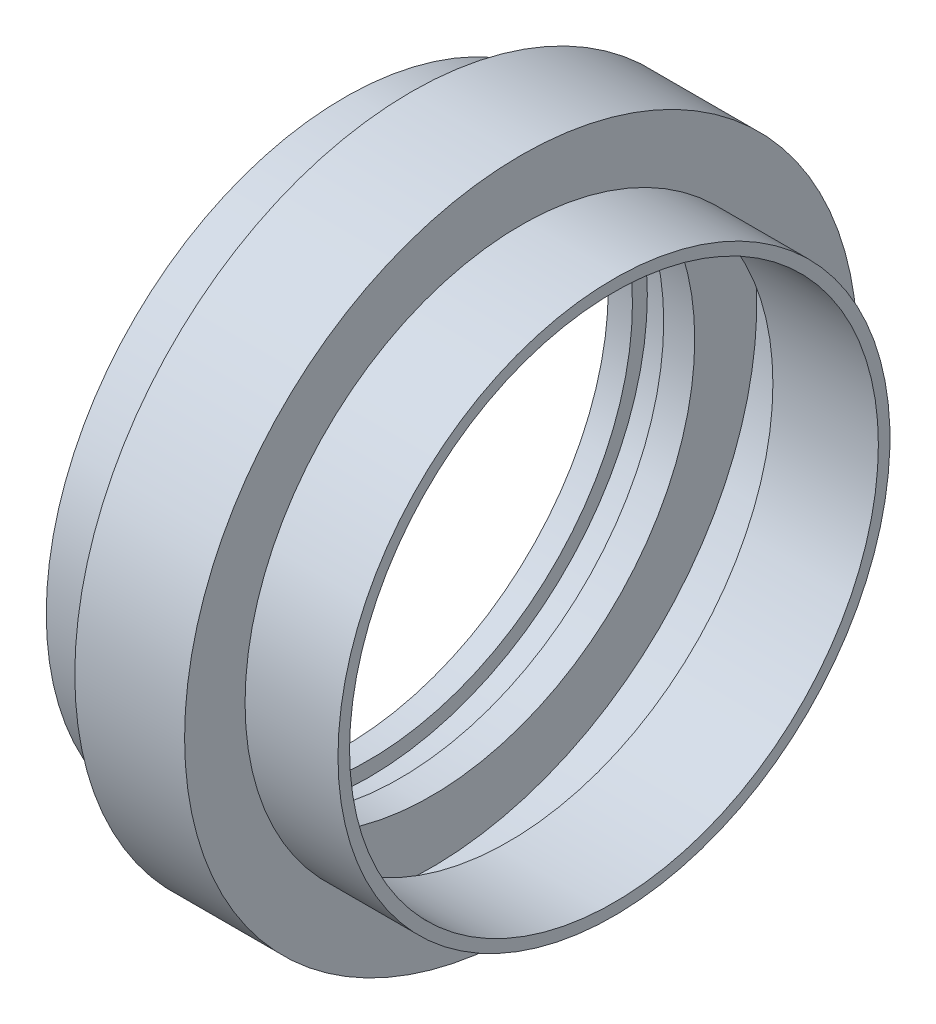
ISO-10303-21;
HEADER;
FILE_DESCRIPTION(('STEP AP214'),'2;1');
FILE_NAME('part.step','',(''),(''),'','','');
FILE_SCHEMA(('AUTOMOTIVE_DESIGN { 1 0 10303 214 1 1 1 1 }'));
ENDSEC;
DATA;
#1=APPLICATION_CONTEXT('core data for automotive mechanical design processes');
#2=APPLICATION_PROTOCOL_DEFINITION('international standard','automotive_design',2000,#1);
#3=PRODUCT_CONTEXT('',#1,'mechanical');
#4=PRODUCT('Part','Part','',(#3));
#5=PRODUCT_RELATED_PRODUCT_CATEGORY('part','',(#4));
#6=PRODUCT_DEFINITION_FORMATION('','',#4);
#7=PRODUCT_DEFINITION_CONTEXT('part definition',#1,'design');
#8=PRODUCT_DEFINITION('design','',#6,#7);
#9=PRODUCT_DEFINITION_SHAPE('','',#8);
#10=(LENGTH_UNIT() NAMED_UNIT(*) SI_UNIT(.MILLI.,.METRE.));
#11=(NAMED_UNIT(*) PLANE_ANGLE_UNIT() SI_UNIT($,.RADIAN.));
#12=(NAMED_UNIT(*) SI_UNIT($,.STERADIAN.) SOLID_ANGLE_UNIT());
#13=UNCERTAINTY_MEASURE_WITH_UNIT(LENGTH_MEASURE(1.E-05),#10,'distance_accuracy_value','');
#14=(GEOMETRIC_REPRESENTATION_CONTEXT(3) GLOBAL_UNCERTAINTY_ASSIGNED_CONTEXT((#13)) GLOBAL_UNIT_ASSIGNED_CONTEXT((#10,
#11,#12)) REPRESENTATION_CONTEXT('',''));
#15=CARTESIAN_POINT('',(0.,0.,0.));
#16=DIRECTION('',(0.,0.,1.));
#17=DIRECTION('',(1.,0.,0.));
#18=AXIS2_PLACEMENT_3D('',#15,#16,#17);
#19=CARTESIAN_POINT('',(8.09094189487786,-54.,0.));
#20=DIRECTION('',(-1.,0.,0.));
#21=DIRECTION('',(0.,0.,1.));
#22=AXIS2_PLACEMENT_3D('',#19,#20,#21);
#23=CYLINDRICAL_SURFACE('',#22,54.);
#24=CARTESIAN_POINT('',(0.,-54.,0.));
#25=DIRECTION('',(-1.,0.,0.));
#26=DIRECTION('',(0.,0.,1.));
#27=AXIS2_PLACEMENT_3D('',#24,#25,#26);
#28=CIRCLE('',#27,54.);
#29=CARTESIAN_POINT('',(0.,-54.,54.));
#30=VERTEX_POINT('',#29);
#31=EDGE_CURVE('E110',#30,#30,#28,.T.);
#32=ORIENTED_EDGE('',*,*,#31,.F.);
#33=EDGE_LOOP('',(#32));
#34=FACE_BOUND('',#33,.T.);
#35=CARTESIAN_POINT('',(-4.95240185899575,-54.,0.));
#36=DIRECTION('',(-1.,0.,0.));
#37=DIRECTION('',(0.,0.,1.));
#38=AXIS2_PLACEMENT_3D('',#35,#36,#37);
#39=CIRCLE('',#38,54.);
#40=CARTESIAN_POINT('',(-4.95240185899575,-54.,54.));
#41=VERTEX_POINT('',#40);
#42=EDGE_CURVE('E10',#41,#41,#39,.T.);
#43=ORIENTED_EDGE('',*,*,#42,.T.);
#44=EDGE_LOOP('',(#43));
#45=FACE_BOUND('',#44,.T.);
#46=ADVANCED_FACE('F43',(#34,#45),#23,.F.);
#47=CARTESIAN_POINT('',(-4.95240185899575,0.,0.));
#48=DIRECTION('',(1.,0.,0.));
#49=DIRECTION('',(0.,0.,-1.));
#50=AXIS2_PLACEMENT_3D('',#47,#48,#49);
#51=PLANE('',#50);
#52=ORIENTED_EDGE('',*,*,#42,.F.);
#53=EDGE_LOOP('',(#52));
#54=FACE_BOUND('',#53,.T.);
#55=CARTESIAN_POINT('',(-4.95240185899575,-54.,0.));
#56=DIRECTION('',(-1.,0.,0.));
#57=DIRECTION('',(0.,0.,1.));
#58=AXIS2_PLACEMENT_3D('',#55,#56,#57);
#59=CIRCLE('',#58,61.0450713550096);
#60=CARTESIAN_POINT('',(-4.95240185899575,-54.,61.0450713550096));
#61=VERTEX_POINT('',#60);
#62=EDGE_CURVE('E50',#61,#61,#59,.T.);
#63=ORIENTED_EDGE('',*,*,#62,.T.);
#64=EDGE_LOOP('',(#63));
#65=FACE_BOUND('',#64,.T.);
#66=ADVANCED_FACE('F118',(#54,#65),#51,.F.);
#67=CARTESIAN_POINT('',(8.09094189487786,-54.,0.));
#68=DIRECTION('',(-1.,0.,0.));
#69=DIRECTION('',(0.,0.,1.));
#70=AXIS2_PLACEMENT_3D('',#67,#68,#69);
#71=CYLINDRICAL_SURFACE('',#70,61.0450713550096);
#72=ORIENTED_EDGE('',*,*,#62,.F.);
#73=EDGE_LOOP('',(#72));
#74=FACE_BOUND('',#73,.T.);
#75=CARTESIAN_POINT('',(8.71607694571134,-54.,0.));
#76=DIRECTION('',(-1.,0.,0.));
#77=DIRECTION('',(0.,0.,1.));
#78=AXIS2_PLACEMENT_3D('',#75,#76,#77);
#79=CIRCLE('',#78,61.0450713550096);
#80=CARTESIAN_POINT('',(8.71607694571134,-54.,61.0450713550096));
#81=VERTEX_POINT('',#80);
#82=EDGE_CURVE('E55',#81,#81,#79,.T.);
#83=ORIENTED_EDGE('',*,*,#82,.T.);
#84=EDGE_LOOP('',(#83));
#85=FACE_BOUND('',#84,.T.);
#86=ADVANCED_FACE('F122',(#74,#85),#71,.T.);
#87=CARTESIAN_POINT('',(8.71607694571134,7.04507135500964,0.));
#88=DIRECTION('',(1.,0.,0.));
#89=DIRECTION('',(0.,0.,-1.));
#90=AXIS2_PLACEMENT_3D('',#87,#88,#89);
#91=PLANE('',#90);
#92=ORIENTED_EDGE('',*,*,#82,.F.);
#93=EDGE_LOOP('',(#92));
#94=FACE_BOUND('',#93,.T.);
#95=CARTESIAN_POINT('',(8.71607694571134,-54.,0.));
#96=DIRECTION('',(-1.,0.,0.));
#97=DIRECTION('',(0.,0.,1.));
#98=AXIS2_PLACEMENT_3D('',#95,#96,#97);
#99=CIRCLE('',#98,68.8713439752832);
#100=CARTESIAN_POINT('',(8.71607694571134,-54.,68.8713439752832));
#101=VERTEX_POINT('',#100);
#102=EDGE_CURVE('E60',#101,#101,#99,.T.);
#103=ORIENTED_EDGE('',*,*,#102,.T.);
#104=EDGE_LOOP('',(#103));
#105=FACE_BOUND('',#104,.T.);
#106=ADVANCED_FACE('F127',(#94,#105),#91,.F.);
#107=CARTESIAN_POINT('',(8.09094189487786,-54.,0.));
#108=DIRECTION('',(-1.,0.,0.));
#109=DIRECTION('',(0.,0.,1.));
#110=AXIS2_PLACEMENT_3D('',#107,#108,#109);
#111=CYLINDRICAL_SURFACE('',#110,68.8713439752832);
#112=ORIENTED_EDGE('',*,*,#102,.F.);
#113=EDGE_LOOP('',(#112));
#114=FACE_BOUND('',#113,.T.);
#115=CARTESIAN_POINT('',(31.1926136320679,-54.,0.));
#116=DIRECTION('',(-1.,0.,0.));
#117=DIRECTION('',(0.,0.,1.));
#118=AXIS2_PLACEMENT_3D('',#115,#116,#117);
#119=CIRCLE('',#118,68.8713439752832);
#120=CARTESIAN_POINT('',(31.1926136320679,-54.,68.8713439752832));
#121=VERTEX_POINT('',#120);
#122=EDGE_CURVE('E66',#121,#121,#119,.T.);
#123=ORIENTED_EDGE('',*,*,#122,.T.);
#124=EDGE_LOOP('',(#123));
#125=FACE_BOUND('',#124,.T.);
#126=ADVANCED_FACE('F133',(#114,#125),#111,.T.);
#127=CARTESIAN_POINT('',(31.1926136320679,14.8713439752832,0.));
#128=DIRECTION('',(-1.,0.,0.));
#129=DIRECTION('',(0.,0.,1.));
#130=AXIS2_PLACEMENT_3D('',#127,#128,#129);
#131=PLANE('',#130);
#132=ORIENTED_EDGE('',*,*,#122,.F.);
#133=EDGE_LOOP('',(#132));
#134=FACE_BOUND('',#133,.T.);
#135=CARTESIAN_POINT('',(31.1926136320679,-54.,0.));
#136=DIRECTION('',(-1.,0.,0.));
#137=DIRECTION('',(0.,0.,1.));
#138=AXIS2_PLACEMENT_3D('',#135,#136,#137);
#139=CIRCLE('',#138,56.4957400427539);
#140=CARTESIAN_POINT('',(31.1926136320679,-54.,56.4957400427539));
#141=VERTEX_POINT('',#140);
#142=EDGE_CURVE('E70',#141,#141,#139,.T.);
#143=ORIENTED_EDGE('',*,*,#142,.T.);
#144=EDGE_LOOP('',(#143));
#145=FACE_BOUND('',#144,.T.);
#146=ADVANCED_FACE('F137',(#134,#145),#131,.F.);
#147=CARTESIAN_POINT('',(8.09094189487786,-54.,0.));
#148=DIRECTION('',(-1.,0.,0.));
#149=DIRECTION('',(0.,0.,1.));
#150=AXIS2_PLACEMENT_3D('',#147,#148,#149);
#151=CYLINDRICAL_SURFACE('',#150,56.4957400427539);
#152=ORIENTED_EDGE('',*,*,#142,.F.);
#153=EDGE_LOOP('',(#152));
#154=FACE_BOUND('',#153,.T.);
#155=CARTESIAN_POINT('',(50.215,-54.,0.));
#156=DIRECTION('',(-1.,0.,0.));
#157=DIRECTION('',(0.,0.,1.));
#158=AXIS2_PLACEMENT_3D('',#155,#156,#157);
#159=CIRCLE('',#158,56.4957400427539);
#160=CARTESIAN_POINT('',(50.215,-54.,56.4957400427539));
#161=VERTEX_POINT('',#160);
#162=EDGE_CURVE('E74',#161,#161,#159,.T.);
#163=ORIENTED_EDGE('',*,*,#162,.T.);
#164=EDGE_LOOP('',(#163));
#165=FACE_BOUND('',#164,.T.);
#166=ADVANCED_FACE('F141',(#154,#165),#151,.T.);
#167=CARTESIAN_POINT('',(50.215,0.127,0.));
#168=DIRECTION('',(-1.,0.,0.));
#169=DIRECTION('',(0.,0.,1.));
#170=AXIS2_PLACEMENT_3D('',#167,#168,#169);
#171=PLANE('',#170);
#172=ORIENTED_EDGE('',*,*,#162,.F.);
#173=EDGE_LOOP('',(#172));
#174=FACE_BOUND('',#173,.T.);
#175=CARTESIAN_POINT('',(50.215,-54.,0.));
#176=DIRECTION('',(-1.,0.,0.));
#177=DIRECTION('',(0.,0.,1.));
#178=AXIS2_PLACEMENT_3D('',#175,#176,#177);
#179=CIRCLE('',#178,54.127);
#180=CARTESIAN_POINT('',(50.215,-54.,54.127));
#181=VERTEX_POINT('',#180);
#182=EDGE_CURVE('E78',#181,#181,#179,.T.);
#183=ORIENTED_EDGE('',*,*,#182,.T.);
#184=EDGE_LOOP('',(#183));
#185=FACE_BOUND('',#184,.T.);
#186=ADVANCED_FACE('F145',(#174,#185),#171,.F.);
#187=CARTESIAN_POINT('',(8.09094189487786,-54.,0.));
#188=DIRECTION('',(-1.,0.,0.));
#189=DIRECTION('',(0.,0.,1.));
#190=AXIS2_PLACEMENT_3D('',#187,#188,#189);
#191=CYLINDRICAL_SURFACE('',#190,54.127);
#192=ORIENTED_EDGE('',*,*,#182,.F.);
#193=EDGE_LOOP('',(#192));
#194=FACE_BOUND('',#193,.T.);
#195=CARTESIAN_POINT('',(28.625,-54.,0.));
#196=DIRECTION('',(-1.,0.,0.));
#197=DIRECTION('',(0.,0.,1.));
#198=AXIS2_PLACEMENT_3D('',#195,#196,#197);
#199=CIRCLE('',#198,54.127);
#200=CARTESIAN_POINT('',(28.625,-54.,54.127));
#201=VERTEX_POINT('',#200);
#202=EDGE_CURVE('E82',#201,#201,#199,.T.);
#203=ORIENTED_EDGE('',*,*,#202,.T.);
#204=EDGE_LOOP('',(#203));
#205=FACE_BOUND('',#204,.T.);
#206=ADVANCED_FACE('F149',(#194,#205),#191,.F.);
#207=CARTESIAN_POINT('',(28.625,12.7,0.));
#208=DIRECTION('',(1.,0.,0.));
#209=DIRECTION('',(0.,0.,-1.));
#210=AXIS2_PLACEMENT_3D('',#207,#208,#209);
#211=PLANE('',#210);
#212=ORIENTED_EDGE('',*,*,#202,.F.);
#213=EDGE_LOOP('',(#212));
#214=FACE_BOUND('',#213,.T.);
#215=CARTESIAN_POINT('',(28.625,-54.,0.));
#216=DIRECTION('',(-1.,0.,0.));
#217=DIRECTION('',(0.,0.,1.));
#218=AXIS2_PLACEMENT_3D('',#215,#216,#217);
#219=CIRCLE('',#218,66.7);
#220=CARTESIAN_POINT('',(28.625,-54.,66.7));
#221=VERTEX_POINT('',#220);
#222=EDGE_CURVE('E86',#221,#221,#219,.T.);
#223=ORIENTED_EDGE('',*,*,#222,.T.);
#224=EDGE_LOOP('',(#223));
#225=FACE_BOUND('',#224,.T.);
#226=ADVANCED_FACE('F153',(#214,#225),#211,.F.);
#227=CARTESIAN_POINT('',(8.09094189487786,-54.,0.));
#228=DIRECTION('',(-1.,0.,0.));
#229=DIRECTION('',(0.,0.,1.));
#230=AXIS2_PLACEMENT_3D('',#227,#228,#229);
#231=CYLINDRICAL_SURFACE('',#230,66.7);
#232=ORIENTED_EDGE('',*,*,#222,.F.);
#233=EDGE_LOOP('',(#232));
#234=FACE_BOUND('',#233,.T.);
#235=CARTESIAN_POINT('',(12.75,-54.,0.));
#236=DIRECTION('',(-1.,0.,0.));
#237=DIRECTION('',(0.,0.,1.));
#238=AXIS2_PLACEMENT_3D('',#235,#236,#237);
#239=CIRCLE('',#238,66.7);
#240=CARTESIAN_POINT('',(12.75,-54.,66.7));
#241=VERTEX_POINT('',#240);
#242=EDGE_CURVE('E90',#241,#241,#239,.T.);
#243=ORIENTED_EDGE('',*,*,#242,.T.);
#244=EDGE_LOOP('',(#243));
#245=FACE_BOUND('',#244,.T.);
#246=ADVANCED_FACE('F157',(#234,#245),#231,.F.);
#247=CARTESIAN_POINT('',(12.75,0.,0.));
#248=DIRECTION('',(-1.,0.,0.));
#249=DIRECTION('',(0.,0.,1.));
#250=AXIS2_PLACEMENT_3D('',#247,#248,#249);
#251=PLANE('',#250);
#252=ORIENTED_EDGE('',*,*,#242,.F.);
#253=EDGE_LOOP('',(#252));
#254=FACE_BOUND('',#253,.T.);
#255=CARTESIAN_POINT('',(12.75,-54.,0.));
#256=DIRECTION('',(-1.,0.,0.));
#257=DIRECTION('',(0.,0.,1.));
#258=AXIS2_PLACEMENT_3D('',#255,#256,#257);
#259=CIRCLE('',#258,54.);
#260=CARTESIAN_POINT('',(12.75,-54.,54.));
#261=VERTEX_POINT('',#260);
#262=EDGE_CURVE('E94',#261,#261,#259,.T.);
#263=ORIENTED_EDGE('',*,*,#262,.T.);
#264=EDGE_LOOP('',(#263));
#265=FACE_BOUND('',#264,.T.);
#266=ADVANCED_FACE('F161',(#254,#265),#251,.F.);
#267=CARTESIAN_POINT('',(8.09094189487786,-54.,0.));
#268=DIRECTION('',(-1.,0.,0.));
#269=DIRECTION('',(0.,0.,1.));
#270=AXIS2_PLACEMENT_3D('',#267,#268,#269);
#271=CYLINDRICAL_SURFACE('',#270,54.);
#272=ORIENTED_EDGE('',*,*,#262,.F.);
#273=EDGE_LOOP('',(#272));
#274=FACE_BOUND('',#273,.T.);
#275=CARTESIAN_POINT('',(6.4,-54.,0.));
#276=DIRECTION('',(-1.,0.,0.));
#277=DIRECTION('',(0.,0.,1.));
#278=AXIS2_PLACEMENT_3D('',#275,#276,#277);
#279=CIRCLE('',#278,54.);
#280=CARTESIAN_POINT('',(6.4,-54.,54.));
#281=VERTEX_POINT('',#280);
#282=EDGE_CURVE('E98',#281,#281,#279,.T.);
#283=ORIENTED_EDGE('',*,*,#282,.T.);
#284=EDGE_LOOP('',(#283));
#285=FACE_BOUND('',#284,.T.);
#286=ADVANCED_FACE('F165',(#274,#285),#271,.F.);
#287=CARTESIAN_POINT('',(6.4,3.048,0.));
#288=DIRECTION('',(1.,0.,0.));
#289=DIRECTION('',(0.,0.,-1.));
#290=AXIS2_PLACEMENT_3D('',#287,#288,#289);
#291=PLANE('',#290);
#292=ORIENTED_EDGE('',*,*,#282,.F.);
#293=EDGE_LOOP('',(#292));
#294=FACE_BOUND('',#293,.T.);
#295=CARTESIAN_POINT('',(6.4,-54.,0.));
#296=DIRECTION('',(-1.,0.,0.));
#297=DIRECTION('',(0.,0.,1.));
#298=AXIS2_PLACEMENT_3D('',#295,#296,#297);
#299=CIRCLE('',#298,57.048);
#300=CARTESIAN_POINT('',(6.4,-54.,57.048));
#301=VERTEX_POINT('',#300);
#302=EDGE_CURVE('E102',#301,#301,#299,.T.);
#303=ORIENTED_EDGE('',*,*,#302,.T.);
#304=EDGE_LOOP('',(#303));
#305=FACE_BOUND('',#304,.T.);
#306=ADVANCED_FACE('F169',(#294,#305),#291,.F.);
#307=CARTESIAN_POINT('',(8.09094189487786,-54.,0.));
#308=DIRECTION('',(-1.,0.,0.));
#309=DIRECTION('',(0.,0.,1.));
#310=AXIS2_PLACEMENT_3D('',#307,#308,#309);
#311=CYLINDRICAL_SURFACE('',#310,57.048);
#312=ORIENTED_EDGE('',*,*,#302,.F.);
#313=EDGE_LOOP('',(#312));
#314=FACE_BOUND('',#313,.T.);
#315=CARTESIAN_POINT('',(0.,-54.,0.));
#316=DIRECTION('',(-1.,0.,0.));
#317=DIRECTION('',(0.,0.,1.));
#318=AXIS2_PLACEMENT_3D('',#315,#316,#317);
#319=CIRCLE('',#318,57.048);
#320=CARTESIAN_POINT('',(0.,-54.,57.048));
#321=VERTEX_POINT('',#320);
#322=EDGE_CURVE('E106',#321,#321,#319,.T.);
#323=ORIENTED_EDGE('',*,*,#322,.T.);
#324=EDGE_LOOP('',(#323));
#325=FACE_BOUND('',#324,.T.);
#326=ADVANCED_FACE('F173',(#314,#325),#311,.F.);
#327=CARTESIAN_POINT('',(0.,0.,0.));
#328=DIRECTION('',(-1.,0.,0.));
#329=DIRECTION('',(0.,0.,1.));
#330=AXIS2_PLACEMENT_3D('',#327,#328,#329);
#331=PLANE('',#330);
#332=ORIENTED_EDGE('',*,*,#322,.F.);
#333=EDGE_LOOP('',(#332));
#334=FACE_BOUND('',#333,.T.);
#335=ORIENTED_EDGE('',*,*,#31,.T.);
#336=EDGE_LOOP('',(#335));
#337=FACE_BOUND('',#336,.T.);
#338=ADVANCED_FACE('F115',(#334,#337),#331,.F.);
#339=CLOSED_SHELL('',(#46,#66,#86,#106,#126,#146,#166,#186,#206,#226,#246,#266,#286,#306,#326,#338));
#340=MANIFOLD_SOLID_BREP('B2',#339);
#341=ADVANCED_BREP_SHAPE_REPRESENTATION('',(#18,#340),#14);
#342=SHAPE_DEFINITION_REPRESENTATION(#9,#341);
ENDSEC;
END-ISO-10303-21;
